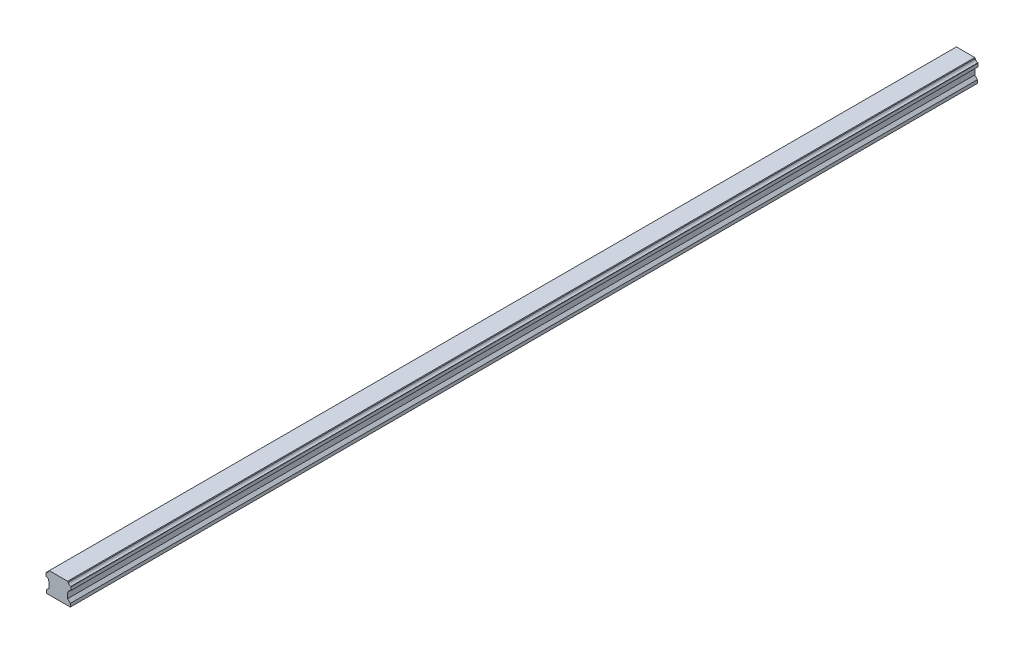
ISO-10303-21;
HEADER;
FILE_DESCRIPTION(('STEP AP214'),'2;1');
FILE_NAME('part.step','',(''),(''),'','','');
FILE_SCHEMA(('AUTOMOTIVE_DESIGN { 1 0 10303 214 1 1 1 1 }'));
ENDSEC;
DATA;
#1=APPLICATION_CONTEXT('core data for automotive mechanical design processes');
#2=APPLICATION_PROTOCOL_DEFINITION('international standard','automotive_design',2000,#1);
#3=PRODUCT_CONTEXT('',#1,'mechanical');
#4=PRODUCT('Part','Part','',(#3));
#5=PRODUCT_RELATED_PRODUCT_CATEGORY('part','',(#4));
#6=PRODUCT_DEFINITION_FORMATION('','',#4);
#7=PRODUCT_DEFINITION_CONTEXT('part definition',#1,'design');
#8=PRODUCT_DEFINITION('design','',#6,#7);
#9=PRODUCT_DEFINITION_SHAPE('','',#8);
#10=(LENGTH_UNIT() NAMED_UNIT(*) SI_UNIT(.MILLI.,.METRE.));
#11=(NAMED_UNIT(*) PLANE_ANGLE_UNIT() SI_UNIT($,.RADIAN.));
#12=(NAMED_UNIT(*) SI_UNIT($,.STERADIAN.) SOLID_ANGLE_UNIT());
#13=UNCERTAINTY_MEASURE_WITH_UNIT(LENGTH_MEASURE(1.E-05),#10,'distance_accuracy_value','');
#14=(GEOMETRIC_REPRESENTATION_CONTEXT(3) GLOBAL_UNCERTAINTY_ASSIGNED_CONTEXT((#13)) GLOBAL_UNIT_ASSIGNED_CONTEXT((#10,
#11,#12)) REPRESENTATION_CONTEXT('',''));
#15=CARTESIAN_POINT('',(0.,0.,0.));
#16=DIRECTION('',(0.,0.,1.));
#17=DIRECTION('',(1.,0.,0.));
#18=AXIS2_PLACEMENT_3D('',#15,#16,#17);
#19=CARTESIAN_POINT('',(5.95775580303827,-4.03413865142313,400.));
#20=DIRECTION('',(0.,0.,-1.));
#21=DIRECTION('',(-1.,0.,0.));
#22=AXIS2_PLACEMENT_3D('',#19,#20,#21);
#23=CYLINDRICAL_SURFACE('',#22,1.19166666666636);
#24=CARTESIAN_POINT('',(5.95775580303827,-4.03413865142313,0.));
#25=DIRECTION('',(0.,0.,1.));
#26=DIRECTION('',(1.,0.,0.));
#27=AXIS2_PLACEMENT_3D('',#24,#25,#26);
#28=CIRCLE('',#27,1.19166666666636);
#29=CARTESIAN_POINT('',(5.8650010671803,-2.84608730429219,0.));
#30=VERTEX_POINT('',#29);
#31=CARTESIAN_POINT('',(4.76970445590733,-3.94138391556516,0.));
#32=VERTEX_POINT('',#31);
#33=EDGE_CURVE('E211',#30,#32,#28,.T.);
#34=ORIENTED_EDGE('',*,*,#33,.F.);
#35=DIRECTION('',(0.,0.,-1.));
#36=VECTOR('',#35,1.);
#37=CARTESIAN_POINT('',(5.8650010671803,-2.84608730429219,400.));
#38=LINE('',#37,#36);
#39=CARTESIAN_POINT('',(5.8650010671803,-2.84608730429219,400.));
#40=VERTEX_POINT('',#39);
#41=EDGE_CURVE('E11',#40,#30,#38,.T.);
#42=ORIENTED_EDGE('',*,*,#41,.F.);
#43=CARTESIAN_POINT('',(5.95775580303827,-4.03413865142313,400.));
#44=DIRECTION('',(0.,0.,1.));
#45=DIRECTION('',(1.,0.,0.));
#46=AXIS2_PLACEMENT_3D('',#43,#44,#45);
#47=CIRCLE('',#46,1.19166666666636);
#48=CARTESIAN_POINT('',(4.76970445590733,-3.94138391556516,400.));
#49=VERTEX_POINT('',#48);
#50=EDGE_CURVE('E271',#40,#49,#47,.T.);
#51=ORIENTED_EDGE('',*,*,#50,.T.);
#52=DIRECTION('',(0.,0.,-1.));
#53=VECTOR('',#52,1.);
#54=CARTESIAN_POINT('',(4.76970445590733,-3.94138391556516,400.));
#55=LINE('',#54,#53);
#56=EDGE_CURVE('E51',#49,#32,#55,.T.);
#57=ORIENTED_EDGE('',*,*,#56,.T.);
#58=EDGE_LOOP('',(#34,#42,#51,#57));
#59=FACE_BOUND('',#58,.T.);
#60=ADVANCED_FACE('F35',(#59),#23,.F.);
#61=CARTESIAN_POINT('',(4.35554418573626,-4.35554418573624,400.));
#62=DIRECTION('',(0.707106781186549,-0.707106781186546,0.));
#63=DIRECTION('',(0.707106781186546,0.707106781186549,0.));
#64=AXIS2_PLACEMENT_3D('',#61,#62,#63);
#65=PLANE('',#64);
#66=DIRECTION('',(-0.707106781186546,-0.707106781186549,0.));
#67=VECTOR('',#66,1.);
#68=CARTESIAN_POINT('',(4.35554418573626,-4.35554418573624,0.));
#69=LINE('',#68,#67);
#70=CARTESIAN_POINT('',(5.95775580303829,-2.75333256843419,0.));
#71=VERTEX_POINT('',#70);
#72=EDGE_CURVE('E213',#71,#30,#69,.T.);
#73=ORIENTED_EDGE('',*,*,#72,.F.);
#74=DIRECTION('',(0.,0.,-1.));
#75=VECTOR('',#74,1.);
#76=CARTESIAN_POINT('',(5.95775580303829,-2.75333256843419,400.));
#77=LINE('',#76,#75);
#78=CARTESIAN_POINT('',(5.95775580303829,-2.75333256843419,400.));
#79=VERTEX_POINT('',#78);
#80=EDGE_CURVE('E43',#79,#71,#77,.T.);
#81=ORIENTED_EDGE('',*,*,#80,.F.);
#82=DIRECTION('',(-0.707106781186546,-0.707106781186549,0.));
#83=VECTOR('',#82,1.);
#84=CARTESIAN_POINT('',(4.35554418573626,-4.35554418573624,400.));
#85=LINE('',#84,#83);
#86=EDGE_CURVE('E330',#79,#40,#85,.T.);
#87=ORIENTED_EDGE('',*,*,#86,.T.);
#88=ORIENTED_EDGE('',*,*,#41,.T.);
#89=EDGE_LOOP('',(#73,#81,#87,#88));
#90=FACE_BOUND('',#89,.T.);
#91=ADVANCED_FACE('F318',(#90),#65,.T.);
#92=CARTESIAN_POINT('',(5.95775580303829,0.,400.));
#93=DIRECTION('',(1.,0.,0.));
#94=DIRECTION('',(0.,0.,-1.));
#95=AXIS2_PLACEMENT_3D('',#92,#93,#94);
#96=PLANE('',#95);
#97=DIRECTION('',(0.,-1.,0.));
#98=VECTOR('',#97,1.);
#99=CARTESIAN_POINT('',(5.95775580303829,0.,0.));
#100=LINE('',#99,#98);
#101=CARTESIAN_POINT('',(5.95775580303829,-1.32333256843459,0.));
#102=VERTEX_POINT('',#101);
#103=EDGE_CURVE('E216',#102,#71,#100,.T.);
#104=ORIENTED_EDGE('',*,*,#103,.F.);
#105=DIRECTION('',(0.,0.,-1.));
#106=VECTOR('',#105,1.);
#107=CARTESIAN_POINT('',(5.95775580303829,-1.32333256843459,400.));
#108=LINE('',#107,#106);
#109=CARTESIAN_POINT('',(5.95775580303829,-1.32333256843459,400.));
#110=VERTEX_POINT('',#109);
#111=EDGE_CURVE('E307',#110,#102,#108,.T.);
#112=ORIENTED_EDGE('',*,*,#111,.F.);
#113=DIRECTION('',(0.,-1.,0.));
#114=VECTOR('',#113,1.);
#115=CARTESIAN_POINT('',(5.95775580303829,0.,400.));
#116=LINE('',#115,#114);
#117=EDGE_CURVE('E314',#110,#79,#116,.T.);
#118=ORIENTED_EDGE('',*,*,#117,.T.);
#119=ORIENTED_EDGE('',*,*,#80,.T.);
#120=EDGE_LOOP('',(#104,#112,#118,#119));
#121=FACE_BOUND('',#120,.T.);
#122=ADVANCED_FACE('F312',(#121),#96,.T.);
#123=CARTESIAN_POINT('',(2.31721161730186,2.31721161730185,400.));
#124=DIRECTION('',(0.707106781186548,0.707106781186547,0.));
#125=DIRECTION('',(-0.707106781186547,0.707106781186548,0.));
#126=AXIS2_PLACEMENT_3D('',#123,#124,#125);
#127=PLANE('',#126);
#128=DIRECTION('',(0.707106781186547,-0.707106781186548,0.));
#129=VECTOR('',#128,1.);
#130=CARTESIAN_POINT('',(2.31721161730186,2.31721161730185,0.));
#131=LINE('',#130,#129);
#132=CARTESIAN_POINT('',(5.86500106718032,-1.23057783257661,0.));
#133=VERTEX_POINT('',#132);
#134=EDGE_CURVE('E219',#133,#102,#131,.T.);
#135=ORIENTED_EDGE('',*,*,#134,.F.);
#136=DIRECTION('',(0.,0.,-1.));
#137=VECTOR('',#136,1.);
#138=CARTESIAN_POINT('',(5.86500106718032,-1.23057783257661,400.));
#139=LINE('',#138,#137);
#140=CARTESIAN_POINT('',(5.86500106718032,-1.23057783257661,400.));
#141=VERTEX_POINT('',#140);
#142=EDGE_CURVE('E305',#141,#133,#139,.T.);
#143=ORIENTED_EDGE('',*,*,#142,.F.);
#144=DIRECTION('',(0.707106781186547,-0.707106781186548,0.));
#145=VECTOR('',#144,1.);
#146=CARTESIAN_POINT('',(2.31721161730186,2.31721161730185,400.));
#147=LINE('',#146,#145);
#148=EDGE_CURVE('E327',#141,#110,#147,.T.);
#149=ORIENTED_EDGE('',*,*,#148,.T.);
#150=ORIENTED_EDGE('',*,*,#111,.T.);
#151=EDGE_LOOP('',(#135,#143,#149,#150));
#152=FACE_BOUND('',#151,.T.);
#153=ADVANCED_FACE('F324',(#152),#127,.T.);
#154=CARTESIAN_POINT('',(5.95775580303829,-0.0425264854456855,400.));
#155=DIRECTION('',(0.,0.,-1.));
#156=DIRECTION('',(-1.,0.,0.));
#157=AXIS2_PLACEMENT_3D('',#154,#155,#156);
#158=CYLINDRICAL_SURFACE('',#157,1.19166666666635);
#159=CARTESIAN_POINT('',(5.95775580303829,-0.0425264854456855,0.));
#160=DIRECTION('',(0.,0.,1.));
#161=DIRECTION('',(1.,0.,0.));
#162=AXIS2_PLACEMENT_3D('',#159,#160,#161);
#163=CIRCLE('',#162,1.19166666666635);
#164=CARTESIAN_POINT('',(4.76970445590737,-0.135281221303723,0.));
#165=VERTEX_POINT('',#164);
#166=EDGE_CURVE('E222',#165,#133,#163,.T.);
#167=ORIENTED_EDGE('',*,*,#166,.F.);
#168=DIRECTION('',(0.,0.,-1.));
#169=VECTOR('',#168,1.);
#170=CARTESIAN_POINT('',(4.76970445590737,-0.135281221303723,400.));
#171=LINE('',#170,#169);
#172=CARTESIAN_POINT('',(4.76970445590737,-0.135281221303723,400.));
#173=VERTEX_POINT('',#172);
#174=EDGE_CURVE('E303',#173,#165,#171,.T.);
#175=ORIENTED_EDGE('',*,*,#174,.F.);
#176=CARTESIAN_POINT('',(5.95775580303829,-0.0425264854456855,400.));
#177=DIRECTION('',(0.,0.,1.));
#178=DIRECTION('',(1.,0.,0.));
#179=AXIS2_PLACEMENT_3D('',#176,#177,#178);
#180=CIRCLE('',#179,1.19166666666635);
#181=EDGE_CURVE('E332',#173,#141,#180,.T.);
#182=ORIENTED_EDGE('',*,*,#181,.T.);
#183=ORIENTED_EDGE('',*,*,#142,.T.);
#184=EDGE_LOOP('',(#167,#175,#182,#183));
#185=FACE_BOUND('',#184,.T.);
#186=ADVANCED_FACE('F406',(#185),#158,.F.);
#187=CARTESIAN_POINT('',(2.31721161730182,2.31721161730182,400.));
#188=DIRECTION('',(0.707106781186547,0.707106781186548,0.));
#189=DIRECTION('',(-0.707106781186548,0.707106781186547,0.));
#190=AXIS2_PLACEMENT_3D('',#187,#188,#189);
#191=PLANE('',#190);
#192=DIRECTION('',(0.707106781186548,-0.707106781186547,0.));
#193=VECTOR('',#192,1.);
#194=CARTESIAN_POINT('',(2.31721161730182,2.31721161730182,0.));
#195=LINE('',#194,#193);
#196=CARTESIAN_POINT('',(4.52775580303876,0.106667431564882,0.));
#197=VERTEX_POINT('',#196);
#198=EDGE_CURVE('E225',#197,#165,#195,.T.);
#199=ORIENTED_EDGE('',*,*,#198,.F.);
#200=DIRECTION('',(0.,0.,-1.));
#201=VECTOR('',#200,1.);
#202=CARTESIAN_POINT('',(4.52775580303876,0.106667431564882,400.));
#203=LINE('',#202,#201);
#204=CARTESIAN_POINT('',(4.52775580303876,0.106667431564882,400.));
#205=VERTEX_POINT('',#204);
#206=EDGE_CURVE('E301',#205,#197,#203,.T.);
#207=ORIENTED_EDGE('',*,*,#206,.F.);
#208=DIRECTION('',(0.707106781186548,-0.707106781186547,0.));
#209=VECTOR('',#208,1.);
#210=CARTESIAN_POINT('',(2.31721161730182,2.31721161730182,400.));
#211=LINE('',#210,#209);
#212=EDGE_CURVE('E338',#205,#173,#211,.T.);
#213=ORIENTED_EDGE('',*,*,#212,.T.);
#214=ORIENTED_EDGE('',*,*,#174,.T.);
#215=EDGE_LOOP('',(#199,#207,#213,#214));
#216=FACE_BOUND('',#215,.T.);
#217=ADVANCED_FACE('F409',(#216),#191,.T.);
#218=CARTESIAN_POINT('',(0.,0.106667431564882,400.));
#219=DIRECTION('',(0.,1.,0.));
#220=DIRECTION('',(0.,0.,1.));
#221=AXIS2_PLACEMENT_3D('',#218,#219,#220);
#222=PLANE('',#221);
#223=DIRECTION('',(1.,0.,0.));
#224=VECTOR('',#223,1.);
#225=CARTESIAN_POINT('',(0.,0.106667431564882,0.));
#226=LINE('',#225,#224);
#227=CARTESIAN_POINT('',(-3.57557753029279,0.106667431564882,0.));
#228=VERTEX_POINT('',#227);
#229=EDGE_CURVE('E228',#228,#197,#226,.T.);
#230=ORIENTED_EDGE('',*,*,#229,.F.);
#231=DIRECTION('',(0.,0.,-1.));
#232=VECTOR('',#231,1.);
#233=CARTESIAN_POINT('',(-3.57557753029279,0.106667431564882,400.));
#234=LINE('',#233,#232);
#235=CARTESIAN_POINT('',(-3.57557753029279,0.106667431564882,400.));
#236=VERTEX_POINT('',#235);
#237=EDGE_CURVE('E299',#236,#228,#234,.T.);
#238=ORIENTED_EDGE('',*,*,#237,.F.);
#239=DIRECTION('',(1.,0.,0.));
#240=VECTOR('',#239,1.);
#241=CARTESIAN_POINT('',(0.,0.106667431564882,400.));
#242=LINE('',#241,#240);
#243=EDGE_CURVE('E341',#236,#205,#242,.T.);
#244=ORIENTED_EDGE('',*,*,#243,.T.);
#245=ORIENTED_EDGE('',*,*,#206,.T.);
#246=EDGE_LOOP('',(#230,#238,#244,#245));
#247=FACE_BOUND('',#246,.T.);
#248=ADVANCED_FACE('F413',(#247),#222,.T.);
#249=CARTESIAN_POINT('',(-1.84112248092884,1.84112248092883,400.));
#250=DIRECTION('',(-0.707106781186549,0.707106781186546,0.));
#251=DIRECTION('',(-0.707106781186546,-0.707106781186549,0.));
#252=AXIS2_PLACEMENT_3D('',#249,#250,#251);
#253=PLANE('',#252);
#254=DIRECTION('',(0.707106781186546,0.707106781186549,0.));
#255=VECTOR('',#254,1.);
#256=CARTESIAN_POINT('',(-1.84112248092884,1.84112248092883,0.));
#257=LINE('',#256,#255);
#258=CARTESIAN_POINT('',(-3.81752618316157,-0.135281221303902,0.));
#259=VERTEX_POINT('',#258);
#260=EDGE_CURVE('E231',#259,#228,#257,.T.);
#261=ORIENTED_EDGE('',*,*,#260,.F.);
#262=DIRECTION('',(0.,0.,-1.));
#263=VECTOR('',#262,1.);
#264=CARTESIAN_POINT('',(-3.81752618316157,-0.135281221303902,400.));
#265=LINE('',#264,#263);
#266=CARTESIAN_POINT('',(-3.81752618316157,-0.135281221303902,400.));
#267=VERTEX_POINT('',#266);
#268=EDGE_CURVE('E297',#267,#259,#265,.T.);
#269=ORIENTED_EDGE('',*,*,#268,.F.);
#270=DIRECTION('',(0.707106781186546,0.707106781186549,0.));
#271=VECTOR('',#270,1.);
#272=CARTESIAN_POINT('',(-1.84112248092884,1.84112248092883,400.));
#273=LINE('',#272,#271);
#274=EDGE_CURVE('E344',#267,#236,#273,.T.);
#275=ORIENTED_EDGE('',*,*,#274,.T.);
#276=ORIENTED_EDGE('',*,*,#237,.T.);
#277=EDGE_LOOP('',(#261,#269,#275,#276));
#278=FACE_BOUND('',#277,.T.);
#279=ADVANCED_FACE('F417',(#278),#253,.T.);
#280=CARTESIAN_POINT('',(-5.00557753029242,-0.042526485445841,400.));
#281=DIRECTION('',(0.,0.,-1.));
#282=DIRECTION('',(-1.,0.,0.));
#283=AXIS2_PLACEMENT_3D('',#280,#281,#282);
#284=CYLINDRICAL_SURFACE('',#283,1.19166666666628);
#285=CARTESIAN_POINT('',(-5.00557753029242,-0.042526485445841,0.));
#286=DIRECTION('',(0.,0.,1.));
#287=DIRECTION('',(1.,0.,0.));
#288=AXIS2_PLACEMENT_3D('',#285,#286,#287);
#289=CIRCLE('',#288,1.19166666666628);
#290=CARTESIAN_POINT('',(-4.91282279443452,-1.2305778325767,0.));
#291=VERTEX_POINT('',#290);
#292=EDGE_CURVE('E234',#291,#259,#289,.T.);
#293=ORIENTED_EDGE('',*,*,#292,.F.);
#294=DIRECTION('',(0.,0.,-1.));
#295=VECTOR('',#294,1.);
#296=CARTESIAN_POINT('',(-4.91282279443452,-1.2305778325767,400.));
#297=LINE('',#296,#295);
#298=CARTESIAN_POINT('',(-4.91282279443452,-1.2305778325767,400.));
#299=VERTEX_POINT('',#298);
#300=EDGE_CURVE('E295',#299,#291,#297,.T.);
#301=ORIENTED_EDGE('',*,*,#300,.F.);
#302=CARTESIAN_POINT('',(-5.00557753029242,-0.042526485445841,400.));
#303=DIRECTION('',(0.,0.,1.));
#304=DIRECTION('',(1.,0.,0.));
#305=AXIS2_PLACEMENT_3D('',#302,#303,#304);
#306=CIRCLE('',#305,1.19166666666628);
#307=EDGE_CURVE('E347',#299,#267,#306,.T.);
#308=ORIENTED_EDGE('',*,*,#307,.T.);
#309=ORIENTED_EDGE('',*,*,#268,.T.);
#310=EDGE_LOOP('',(#293,#301,#308,#309));
#311=FACE_BOUND('',#310,.T.);
#312=ADVANCED_FACE('F421',(#311),#284,.F.);
#313=CARTESIAN_POINT('',(-1.84112248092891,1.84112248092891,400.));
#314=DIRECTION('',(-0.707106781186548,0.707106781186548,0.));
#315=DIRECTION('',(-0.707106781186548,-0.707106781186548,0.));
#316=AXIS2_PLACEMENT_3D('',#313,#314,#315);
#317=PLANE('',#316);
#318=DIRECTION('',(0.707106781186548,0.707106781186548,0.));
#319=VECTOR('',#318,1.);
#320=CARTESIAN_POINT('',(-1.84112248092891,1.84112248092891,0.));
#321=LINE('',#320,#319);
#322=CARTESIAN_POINT('',(-5.00557753029242,-1.3233325684346,0.));
#323=VERTEX_POINT('',#322);
#324=EDGE_CURVE('E237',#323,#291,#321,.T.);
#325=ORIENTED_EDGE('',*,*,#324,.F.);
#326=DIRECTION('',(0.,0.,-1.));
#327=VECTOR('',#326,1.);
#328=CARTESIAN_POINT('',(-5.00557753029242,-1.3233325684346,400.));
#329=LINE('',#328,#327);
#330=CARTESIAN_POINT('',(-5.00557753029242,-1.3233325684346,400.));
#331=VERTEX_POINT('',#330);
#332=EDGE_CURVE('E293',#331,#323,#329,.T.);
#333=ORIENTED_EDGE('',*,*,#332,.F.);
#334=DIRECTION('',(0.707106781186548,0.707106781186548,0.));
#335=VECTOR('',#334,1.);
#336=CARTESIAN_POINT('',(-1.84112248092891,1.84112248092891,400.));
#337=LINE('',#336,#335);
#338=EDGE_CURVE('E350',#331,#299,#337,.T.);
#339=ORIENTED_EDGE('',*,*,#338,.T.);
#340=ORIENTED_EDGE('',*,*,#300,.T.);
#341=EDGE_LOOP('',(#325,#333,#339,#340));
#342=FACE_BOUND('',#341,.T.);
#343=ADVANCED_FACE('F425',(#342),#317,.T.);
#344=CARTESIAN_POINT('',(-5.00557753029242,0.,400.));
#345=DIRECTION('',(-1.,0.,0.));
#346=DIRECTION('',(0.,0.,1.));
#347=AXIS2_PLACEMENT_3D('',#344,#345,#346);
#348=PLANE('',#347);
#349=DIRECTION('',(0.,1.,0.));
#350=VECTOR('',#349,1.);
#351=CARTESIAN_POINT('',(-5.00557753029242,0.,0.));
#352=LINE('',#351,#350);
#353=CARTESIAN_POINT('',(-5.00557753029242,-2.75333256843423,0.));
#354=VERTEX_POINT('',#353);
#355=EDGE_CURVE('E240',#354,#323,#352,.T.);
#356=ORIENTED_EDGE('',*,*,#355,.F.);
#357=DIRECTION('',(0.,0.,-1.));
#358=VECTOR('',#357,1.);
#359=CARTESIAN_POINT('',(-5.00557753029242,-2.75333256843423,400.));
#360=LINE('',#359,#358);
#361=CARTESIAN_POINT('',(-5.00557753029242,-2.75333256843423,400.));
#362=VERTEX_POINT('',#361);
#363=EDGE_CURVE('E291',#362,#354,#360,.T.);
#364=ORIENTED_EDGE('',*,*,#363,.F.);
#365=DIRECTION('',(0.,1.,0.));
#366=VECTOR('',#365,1.);
#367=CARTESIAN_POINT('',(-5.00557753029242,0.,400.));
#368=LINE('',#367,#366);
#369=EDGE_CURVE('E353',#362,#331,#368,.T.);
#370=ORIENTED_EDGE('',*,*,#369,.T.);
#371=ORIENTED_EDGE('',*,*,#332,.T.);
#372=EDGE_LOOP('',(#356,#364,#370,#371));
#373=FACE_BOUND('',#372,.T.);
#374=ADVANCED_FACE('F429',(#373),#348,.T.);
#375=CARTESIAN_POINT('',(-3.87945504936331,-3.87945504936333,400.));
#376=DIRECTION('',(-0.707106781186546,-0.707106781186549,0.));
#377=DIRECTION('',(0.707106781186549,-0.707106781186546,0.));
#378=AXIS2_PLACEMENT_3D('',#375,#376,#377);
#379=PLANE('',#378);
#380=DIRECTION('',(-0.707106781186549,0.707106781186546,0.));
#381=VECTOR('',#380,1.);
#382=CARTESIAN_POINT('',(-3.87945504936331,-3.87945504936333,0.));
#383=LINE('',#382,#381);
#384=CARTESIAN_POINT('',(-4.91282279443445,-2.84608730429221,0.));
#385=VERTEX_POINT('',#384);
#386=EDGE_CURVE('E243',#385,#354,#383,.T.);
#387=ORIENTED_EDGE('',*,*,#386,.F.);
#388=DIRECTION('',(0.,0.,-1.));
#389=VECTOR('',#388,1.);
#390=CARTESIAN_POINT('',(-4.91282279443445,-2.84608730429221,400.));
#391=LINE('',#390,#389);
#392=CARTESIAN_POINT('',(-4.91282279443445,-2.84608730429221,400.));
#393=VERTEX_POINT('',#392);
#394=EDGE_CURVE('E289',#393,#385,#391,.T.);
#395=ORIENTED_EDGE('',*,*,#394,.F.);
#396=DIRECTION('',(-0.707106781186549,0.707106781186546,0.));
#397=VECTOR('',#396,1.);
#398=CARTESIAN_POINT('',(-3.87945504936331,-3.87945504936333,400.));
#399=LINE('',#398,#397);
#400=EDGE_CURVE('E356',#393,#362,#399,.T.);
#401=ORIENTED_EDGE('',*,*,#400,.T.);
#402=ORIENTED_EDGE('',*,*,#363,.T.);
#403=EDGE_LOOP('',(#387,#395,#401,#402));
#404=FACE_BOUND('',#403,.T.);
#405=ADVANCED_FACE('F433',(#404),#379,.T.);
#406=CARTESIAN_POINT('',(-5.00557753029242,-4.03413865142314,400.));
#407=DIRECTION('',(0.,0.,-1.));
#408=DIRECTION('',(-1.,0.,0.));
#409=AXIS2_PLACEMENT_3D('',#406,#407,#408);
#410=CYLINDRICAL_SURFACE('',#409,1.19166666666636);
#411=CARTESIAN_POINT('',(-5.00557753029242,-4.03413865142314,0.));
#412=DIRECTION('',(0.,0.,1.));
#413=DIRECTION('',(1.,0.,0.));
#414=AXIS2_PLACEMENT_3D('',#411,#412,#413);
#415=CIRCLE('',#414,1.19166666666636);
#416=CARTESIAN_POINT('',(-3.81752618316149,-3.94138391556517,0.));
#417=VERTEX_POINT('',#416);
#418=EDGE_CURVE('E246',#417,#385,#415,.T.);
#419=ORIENTED_EDGE('',*,*,#418,.F.);
#420=DIRECTION('',(0.,0.,-1.));
#421=VECTOR('',#420,1.);
#422=CARTESIAN_POINT('',(-3.81752618316149,-3.94138391556517,400.));
#423=LINE('',#422,#421);
#424=CARTESIAN_POINT('',(-3.81752618316149,-3.94138391556517,400.));
#425=VERTEX_POINT('',#424);
#426=EDGE_CURVE('E287',#425,#417,#423,.T.);
#427=ORIENTED_EDGE('',*,*,#426,.F.);
#428=CARTESIAN_POINT('',(-5.00557753029242,-4.03413865142314,400.));
#429=DIRECTION('',(0.,0.,1.));
#430=DIRECTION('',(1.,0.,0.));
#431=AXIS2_PLACEMENT_3D('',#428,#429,#430);
#432=CIRCLE('',#431,1.19166666666636);
#433=EDGE_CURVE('E359',#425,#393,#432,.T.);
#434=ORIENTED_EDGE('',*,*,#433,.T.);
#435=ORIENTED_EDGE('',*,*,#394,.T.);
#436=EDGE_LOOP('',(#419,#427,#434,#435));
#437=FACE_BOUND('',#436,.T.);
#438=ADVANCED_FACE('F437',(#437),#410,.F.);
#439=CARTESIAN_POINT('',(-3.87945504936333,-3.87945504936332,400.));
#440=DIRECTION('',(-0.707106781186548,-0.707106781186547,0.));
#441=DIRECTION('',(0.707106781186547,-0.707106781186548,0.));
#442=AXIS2_PLACEMENT_3D('',#439,#440,#441);
#443=PLANE('',#442);
#444=DIRECTION('',(-0.707106781186547,0.707106781186548,0.));
#445=VECTOR('',#444,1.);
#446=CARTESIAN_POINT('',(-3.87945504936333,-3.87945504936332,0.));
#447=LINE('',#446,#445);
#448=CARTESIAN_POINT('',(-3.57557753029273,-4.18333256843392,0.));
#449=VERTEX_POINT('',#448);
#450=EDGE_CURVE('E249',#449,#417,#447,.T.);
#451=ORIENTED_EDGE('',*,*,#450,.F.);
#452=DIRECTION('',(0.,0.,-1.));
#453=VECTOR('',#452,1.);
#454=CARTESIAN_POINT('',(-3.57557753029273,-4.18333256843392,400.));
#455=LINE('',#454,#453);
#456=CARTESIAN_POINT('',(-3.57557753029273,-4.18333256843392,400.));
#457=VERTEX_POINT('',#456);
#458=EDGE_CURVE('E285',#457,#449,#455,.T.);
#459=ORIENTED_EDGE('',*,*,#458,.F.);
#460=DIRECTION('',(-0.707106781186547,0.707106781186548,0.));
#461=VECTOR('',#460,1.);
#462=CARTESIAN_POINT('',(-3.87945504936333,-3.87945504936332,400.));
#463=LINE('',#462,#461);
#464=EDGE_CURVE('E362',#457,#425,#463,.T.);
#465=ORIENTED_EDGE('',*,*,#464,.T.);
#466=ORIENTED_EDGE('',*,*,#426,.T.);
#467=EDGE_LOOP('',(#451,#459,#465,#466));
#468=FACE_BOUND('',#467,.T.);
#469=ADVANCED_FACE('F441',(#468),#443,.T.);
#470=CARTESIAN_POINT('',(-3.57557753029273,0.,400.));
#471=DIRECTION('',(-1.,0.,0.));
#472=DIRECTION('',(0.,0.,1.));
#473=AXIS2_PLACEMENT_3D('',#470,#471,#472);
#474=PLANE('',#473);
#475=DIRECTION('',(0.,1.,0.));
#476=VECTOR('',#475,1.);
#477=CARTESIAN_POINT('',(-3.57557753029273,0.,0.));
#478=LINE('',#477,#476);
#479=CARTESIAN_POINT('',(-3.57557753029273,-6.56666590176662,0.));
#480=VERTEX_POINT('',#479);
#481=EDGE_CURVE('E252',#480,#449,#478,.T.);
#482=ORIENTED_EDGE('',*,*,#481,.F.);
#483=DIRECTION('',(0.,0.,-1.));
#484=VECTOR('',#483,1.);
#485=CARTESIAN_POINT('',(-3.57557753029273,-6.56666590176662,400.));
#486=LINE('',#485,#484);
#487=CARTESIAN_POINT('',(-3.57557753029273,-6.56666590176662,400.));
#488=VERTEX_POINT('',#487);
#489=EDGE_CURVE('E283',#488,#480,#486,.T.);
#490=ORIENTED_EDGE('',*,*,#489,.F.);
#491=DIRECTION('',(0.,1.,0.));
#492=VECTOR('',#491,1.);
#493=CARTESIAN_POINT('',(-3.57557753029273,0.,400.));
#494=LINE('',#493,#492);
#495=EDGE_CURVE('E365',#488,#457,#494,.T.);
#496=ORIENTED_EDGE('',*,*,#495,.T.);
#497=ORIENTED_EDGE('',*,*,#458,.T.);
#498=EDGE_LOOP('',(#482,#490,#496,#497));
#499=FACE_BOUND('',#498,.T.);
#500=ADVANCED_FACE('F445',(#499),#474,.T.);
#501=CARTESIAN_POINT('',(1.49554418573694,-1.49554418573694,400.));
#502=DIRECTION('',(-0.707106781186547,0.707106781186548,0.));
#503=DIRECTION('',(-0.707106781186548,-0.707106781186547,0.));
#504=AXIS2_PLACEMENT_3D('',#501,#502,#503);
#505=PLANE('',#504);
#506=DIRECTION('',(0.707106781186548,0.707106781186547,0.));
#507=VECTOR('',#506,1.);
#508=CARTESIAN_POINT('',(1.49554418573694,-1.49554418573694,0.));
#509=LINE('',#508,#507);
#510=CARTESIAN_POINT('',(-4.76724419695908,-7.75833256843296,0.));
#511=VERTEX_POINT('',#510);
#512=EDGE_CURVE('E255',#511,#480,#509,.T.);
#513=ORIENTED_EDGE('',*,*,#512,.F.);
#514=DIRECTION('',(0.,0.,-1.));
#515=VECTOR('',#514,1.);
#516=CARTESIAN_POINT('',(-4.76724419695908,-7.75833256843296,400.));
#517=LINE('',#516,#515);
#518=CARTESIAN_POINT('',(-4.76724419695908,-7.75833256843296,400.));
#519=VERTEX_POINT('',#518);
#520=EDGE_CURVE('E281',#519,#511,#517,.T.);
#521=ORIENTED_EDGE('',*,*,#520,.F.);
#522=DIRECTION('',(0.707106781186548,0.707106781186547,0.));
#523=VECTOR('',#522,1.);
#524=CARTESIAN_POINT('',(1.49554418573694,-1.49554418573694,400.));
#525=LINE('',#524,#523);
#526=EDGE_CURVE('E368',#519,#488,#525,.T.);
#527=ORIENTED_EDGE('',*,*,#526,.T.);
#528=ORIENTED_EDGE('',*,*,#489,.T.);
#529=EDGE_LOOP('',(#513,#521,#527,#528));
#530=FACE_BOUND('',#529,.T.);
#531=ADVANCED_FACE('F449',(#530),#505,.T.);
#532=CARTESIAN_POINT('',(-4.76724419695908,0.,400.));
#533=DIRECTION('',(1.,0.,0.));
#534=DIRECTION('',(0.,0.,-1.));
#535=AXIS2_PLACEMENT_3D('',#532,#533,#534);
#536=PLANE('',#535);
#537=DIRECTION('',(0.,-1.,0.));
#538=VECTOR('',#537,1.);
#539=CARTESIAN_POINT('',(-4.76724419695908,0.,0.));
#540=LINE('',#539,#538);
#541=CARTESIAN_POINT('',(-4.76724419695908,-9.18833256843297,0.));
#542=VERTEX_POINT('',#541);
#543=EDGE_CURVE('E258',#511,#542,#540,.T.);
#544=ORIENTED_EDGE('',*,*,#543,.T.);
#545=DIRECTION('',(0.,0.,-1.));
#546=VECTOR('',#545,1.);
#547=CARTESIAN_POINT('',(-4.76724419695908,-9.18833256843297,400.));
#548=LINE('',#547,#546);
#549=CARTESIAN_POINT('',(-4.76724419695908,-9.18833256843297,400.));
#550=VERTEX_POINT('',#549);
#551=EDGE_CURVE('E278',#550,#542,#548,.T.);
#552=ORIENTED_EDGE('',*,*,#551,.F.);
#553=DIRECTION('',(0.,-1.,0.));
#554=VECTOR('',#553,1.);
#555=CARTESIAN_POINT('',(-4.76724419695908,0.,400.));
#556=LINE('',#555,#554);
#557=EDGE_CURVE('E371',#519,#550,#556,.T.);
#558=ORIENTED_EDGE('',*,*,#557,.F.);
#559=ORIENTED_EDGE('',*,*,#520,.T.);
#560=EDGE_LOOP('',(#544,#552,#558,#559));
#561=FACE_BOUND('',#560,.T.);
#562=ADVANCED_FACE('F453',(#561),#536,.F.);
#563=CARTESIAN_POINT('',(0.,-9.18833256843297,400.));
#564=DIRECTION('',(0.,1.,0.));
#565=DIRECTION('',(0.,0.,1.));
#566=AXIS2_PLACEMENT_3D('',#563,#564,#565);
#567=PLANE('',#566);
#568=DIRECTION('',(1.,0.,0.));
#569=VECTOR('',#568,1.);
#570=CARTESIAN_POINT('',(0.,-9.18833256843297,0.));
#571=LINE('',#570,#569);
#572=CARTESIAN_POINT('',(5.71942246970502,-9.18833256843297,0.));
#573=VERTEX_POINT('',#572);
#574=EDGE_CURVE('E260',#542,#573,#571,.T.);
#575=ORIENTED_EDGE('',*,*,#574,.T.);
#576=DIRECTION('',(0.,0.,-1.));
#577=VECTOR('',#576,1.);
#578=CARTESIAN_POINT('',(5.71942246970502,-9.18833256843297,400.));
#579=LINE('',#578,#577);
#580=CARTESIAN_POINT('',(5.71942246970502,-9.18833256843297,400.));
#581=VERTEX_POINT('',#580);
#582=EDGE_CURVE('E275',#581,#573,#579,.T.);
#583=ORIENTED_EDGE('',*,*,#582,.F.);
#584=DIRECTION('',(1.,0.,0.));
#585=VECTOR('',#584,1.);
#586=CARTESIAN_POINT('',(0.,-9.18833256843297,400.));
#587=LINE('',#586,#585);
#588=EDGE_CURVE('E373',#550,#581,#587,.T.);
#589=ORIENTED_EDGE('',*,*,#588,.F.);
#590=ORIENTED_EDGE('',*,*,#551,.T.);
#591=EDGE_LOOP('',(#575,#583,#589,#590));
#592=FACE_BOUND('',#591,.T.);
#593=ADVANCED_FACE('F380',(#592),#567,.F.);
#594=CARTESIAN_POINT('',(5.71942246970502,0.,400.));
#595=DIRECTION('',(-1.,0.,0.));
#596=DIRECTION('',(0.,0.,1.));
#597=AXIS2_PLACEMENT_3D('',#594,#595,#596);
#598=PLANE('',#597);
#599=DIRECTION('',(0.,1.,0.));
#600=VECTOR('',#599,1.);
#601=CARTESIAN_POINT('',(5.71942246970502,0.,0.));
#602=LINE('',#601,#600);
#603=CARTESIAN_POINT('',(5.71942246970502,-7.75833256843291,0.));
#604=VERTEX_POINT('',#603);
#605=EDGE_CURVE('E262',#573,#604,#602,.T.);
#606=ORIENTED_EDGE('',*,*,#605,.T.);
#607=DIRECTION('',(0.,0.,-1.));
#608=VECTOR('',#607,1.);
#609=CARTESIAN_POINT('',(5.71942246970502,-7.75833256843291,400.));
#610=LINE('',#609,#608);
#611=CARTESIAN_POINT('',(5.71942246970502,-7.75833256843291,400.));
#612=VERTEX_POINT('',#611);
#613=EDGE_CURVE('E194',#612,#604,#610,.T.);
#614=ORIENTED_EDGE('',*,*,#613,.F.);
#615=DIRECTION('',(0.,1.,0.));
#616=VECTOR('',#615,1.);
#617=CARTESIAN_POINT('',(5.71942246970502,0.,400.));
#618=LINE('',#617,#616);
#619=EDGE_CURVE('E202',#581,#612,#618,.T.);
#620=ORIENTED_EDGE('',*,*,#619,.F.);
#621=ORIENTED_EDGE('',*,*,#582,.T.);
#622=EDGE_LOOP('',(#606,#614,#620,#621));
#623=FACE_BOUND('',#622,.T.);
#624=ADVANCED_FACE('F384',(#623),#598,.F.);
#625=CARTESIAN_POINT('',(-1.01945504936395,-1.01945504936395,400.));
#626=DIRECTION('',(0.707106781186547,0.707106781186548,0.));
#627=DIRECTION('',(-0.707106781186548,0.707106781186547,0.));
#628=AXIS2_PLACEMENT_3D('',#625,#626,#627);
#629=PLANE('',#628);
#630=DIRECTION('',(0.707106781186548,-0.707106781186547,0.));
#631=VECTOR('',#630,1.);
#632=CARTESIAN_POINT('',(-1.01945504936395,-1.01945504936395,0.));
#633=LINE('',#632,#631);
#634=CARTESIAN_POINT('',(4.52775580303863,-6.56666590176652,0.));
#635=VERTEX_POINT('',#634);
#636=EDGE_CURVE('E190',#635,#604,#633,.T.);
#637=ORIENTED_EDGE('',*,*,#636,.F.);
#638=DIRECTION('',(0.,0.,-1.));
#639=VECTOR('',#638,1.);
#640=CARTESIAN_POINT('',(4.52775580303863,-6.56666590176652,400.));
#641=LINE('',#640,#639);
#642=CARTESIAN_POINT('',(4.52775580303863,-6.56666590176652,400.));
#643=VERTEX_POINT('',#642);
#644=EDGE_CURVE('E185',#643,#635,#641,.T.);
#645=ORIENTED_EDGE('',*,*,#644,.F.);
#646=DIRECTION('',(0.707106781186548,-0.707106781186547,0.));
#647=VECTOR('',#646,1.);
#648=CARTESIAN_POINT('',(-1.01945504936395,-1.01945504936395,400.));
#649=LINE('',#648,#647);
#650=EDGE_CURVE('E188',#643,#612,#649,.T.);
#651=ORIENTED_EDGE('',*,*,#650,.T.);
#652=ORIENTED_EDGE('',*,*,#613,.T.);
#653=EDGE_LOOP('',(#637,#645,#651,#652));
#654=FACE_BOUND('',#653,.T.);
#655=ADVANCED_FACE('F187',(#654),#629,.T.);
#656=CARTESIAN_POINT('',(4.52775580303863,0.,400.));
#657=DIRECTION('',(1.,0.,0.));
#658=DIRECTION('',(0.,0.,-1.));
#659=AXIS2_PLACEMENT_3D('',#656,#657,#658);
#660=PLANE('',#659);
#661=DIRECTION('',(0.,-1.,0.));
#662=VECTOR('',#661,1.);
#663=CARTESIAN_POINT('',(4.52775580303863,0.,0.));
#664=LINE('',#663,#662);
#665=CARTESIAN_POINT('',(4.52775580303863,-4.18333256843385,0.));
#666=VERTEX_POINT('',#665);
#667=EDGE_CURVE('E266',#666,#635,#664,.T.);
#668=ORIENTED_EDGE('',*,*,#667,.F.);
#669=DIRECTION('',(0.,0.,-1.));
#670=VECTOR('',#669,1.);
#671=CARTESIAN_POINT('',(4.52775580303863,-4.18333256843385,400.));
#672=LINE('',#671,#670);
#673=CARTESIAN_POINT('',(4.52775580303863,-4.18333256843385,400.));
#674=VERTEX_POINT('',#673);
#675=EDGE_CURVE('E118',#674,#666,#672,.T.);
#676=ORIENTED_EDGE('',*,*,#675,.F.);
#677=DIRECTION('',(0.,-1.,0.));
#678=VECTOR('',#677,1.);
#679=CARTESIAN_POINT('',(4.52775580303863,0.,400.));
#680=LINE('',#679,#678);
#681=EDGE_CURVE('E200',#674,#643,#680,.T.);
#682=ORIENTED_EDGE('',*,*,#681,.T.);
#683=ORIENTED_EDGE('',*,*,#644,.T.);
#684=EDGE_LOOP('',(#668,#676,#682,#683));
#685=FACE_BOUND('',#684,.T.);
#686=ADVANCED_FACE('F205',(#685),#660,.T.);
#687=CARTESIAN_POINT('',(4.35554418573624,-4.35554418573625,400.));
#688=DIRECTION('',(0.707106781186546,-0.707106781186549,0.));
#689=DIRECTION('',(0.707106781186549,0.707106781186546,0.));
#690=AXIS2_PLACEMENT_3D('',#687,#688,#689);
#691=PLANE('',#690);
#692=DIRECTION('',(-0.707106781186549,-0.707106781186546,0.));
#693=VECTOR('',#692,1.);
#694=CARTESIAN_POINT('',(4.35554418573624,-4.35554418573625,0.));
#695=LINE('',#694,#693);
#696=EDGE_CURVE('E268',#32,#666,#695,.T.);
#697=ORIENTED_EDGE('',*,*,#696,.F.);
#698=ORIENTED_EDGE('',*,*,#56,.F.);
#699=DIRECTION('',(-0.707106781186549,-0.707106781186546,0.));
#700=VECTOR('',#699,1.);
#701=CARTESIAN_POINT('',(4.35554418573624,-4.35554418573625,400.));
#702=LINE('',#701,#700);
#703=EDGE_CURVE('E206',#49,#674,#702,.T.);
#704=ORIENTED_EDGE('',*,*,#703,.T.);
#705=ORIENTED_EDGE('',*,*,#675,.T.);
#706=EDGE_LOOP('',(#697,#698,#704,#705));
#707=FACE_BOUND('',#706,.T.);
#708=ADVANCED_FACE('F385',(#707),#691,.T.);
#709=CARTESIAN_POINT('',(0.,0.,400.));
#710=DIRECTION('',(0.,0.,1.));
#711=DIRECTION('',(1.,0.,0.));
#712=AXIS2_PLACEMENT_3D('',#709,#710,#711);
#713=PLANE('',#712);
#714=ORIENTED_EDGE('',*,*,#50,.F.);
#715=ORIENTED_EDGE('',*,*,#86,.F.);
#716=ORIENTED_EDGE('',*,*,#117,.F.);
#717=ORIENTED_EDGE('',*,*,#148,.F.);
#718=ORIENTED_EDGE('',*,*,#181,.F.);
#719=ORIENTED_EDGE('',*,*,#212,.F.);
#720=ORIENTED_EDGE('',*,*,#243,.F.);
#721=ORIENTED_EDGE('',*,*,#274,.F.);
#722=ORIENTED_EDGE('',*,*,#307,.F.);
#723=ORIENTED_EDGE('',*,*,#338,.F.);
#724=ORIENTED_EDGE('',*,*,#369,.F.);
#725=ORIENTED_EDGE('',*,*,#400,.F.);
#726=ORIENTED_EDGE('',*,*,#433,.F.);
#727=ORIENTED_EDGE('',*,*,#464,.F.);
#728=ORIENTED_EDGE('',*,*,#495,.F.);
#729=ORIENTED_EDGE('',*,*,#526,.F.);
#730=ORIENTED_EDGE('',*,*,#557,.T.);
#731=ORIENTED_EDGE('',*,*,#588,.T.);
#732=ORIENTED_EDGE('',*,*,#619,.T.);
#733=ORIENTED_EDGE('',*,*,#650,.F.);
#734=ORIENTED_EDGE('',*,*,#681,.F.);
#735=ORIENTED_EDGE('',*,*,#703,.F.);
#736=EDGE_LOOP('',(#714,#715,#716,#717,#718,#719,#720,#721,#722,#723,#724,#725,#726,#727,#728,
#729,#730,#731,#732,#733,#734,#735));
#737=FACE_BOUND('',#736,.T.);
#738=ADVANCED_FACE('F198',(#737),#713,.T.);
#739=CARTESIAN_POINT('',(0.,0.,0.));
#740=DIRECTION('',(0.,0.,1.));
#741=DIRECTION('',(1.,0.,0.));
#742=AXIS2_PLACEMENT_3D('',#739,#740,#741);
#743=PLANE('',#742);
#744=ORIENTED_EDGE('',*,*,#33,.T.);
#745=ORIENTED_EDGE('',*,*,#696,.T.);
#746=ORIENTED_EDGE('',*,*,#667,.T.);
#747=ORIENTED_EDGE('',*,*,#636,.T.);
#748=ORIENTED_EDGE('',*,*,#605,.F.);
#749=ORIENTED_EDGE('',*,*,#574,.F.);
#750=ORIENTED_EDGE('',*,*,#543,.F.);
#751=ORIENTED_EDGE('',*,*,#512,.T.);
#752=ORIENTED_EDGE('',*,*,#481,.T.);
#753=ORIENTED_EDGE('',*,*,#450,.T.);
#754=ORIENTED_EDGE('',*,*,#418,.T.);
#755=ORIENTED_EDGE('',*,*,#386,.T.);
#756=ORIENTED_EDGE('',*,*,#355,.T.);
#757=ORIENTED_EDGE('',*,*,#324,.T.);
#758=ORIENTED_EDGE('',*,*,#292,.T.);
#759=ORIENTED_EDGE('',*,*,#260,.T.);
#760=ORIENTED_EDGE('',*,*,#229,.T.);
#761=ORIENTED_EDGE('',*,*,#198,.T.);
#762=ORIENTED_EDGE('',*,*,#166,.T.);
#763=ORIENTED_EDGE('',*,*,#134,.T.);
#764=ORIENTED_EDGE('',*,*,#103,.T.);
#765=ORIENTED_EDGE('',*,*,#72,.T.);
#766=EDGE_LOOP('',(#744,#745,#746,#747,#748,#749,#750,#751,#752,#753,#754,#755,#756,#757,#758,
#759,#760,#761,#762,#763,#764,#765));
#767=FACE_BOUND('',#766,.T.);
#768=ADVANCED_FACE('F320',(#767),#743,.F.);
#769=CLOSED_SHELL('',(#60,#91,#122,#153,#186,#217,#248,#279,#312,#343,#374,#405,#438,#469,#500,
#531,#562,#593,#624,#655,#686,#708,#738,#768));
#770=MANIFOLD_SOLID_BREP('B2',#769);
#771=ADVANCED_BREP_SHAPE_REPRESENTATION('',(#18,#770),#14);
#772=SHAPE_DEFINITION_REPRESENTATION(#9,#771);
ENDSEC;
END-ISO-10303-21;
